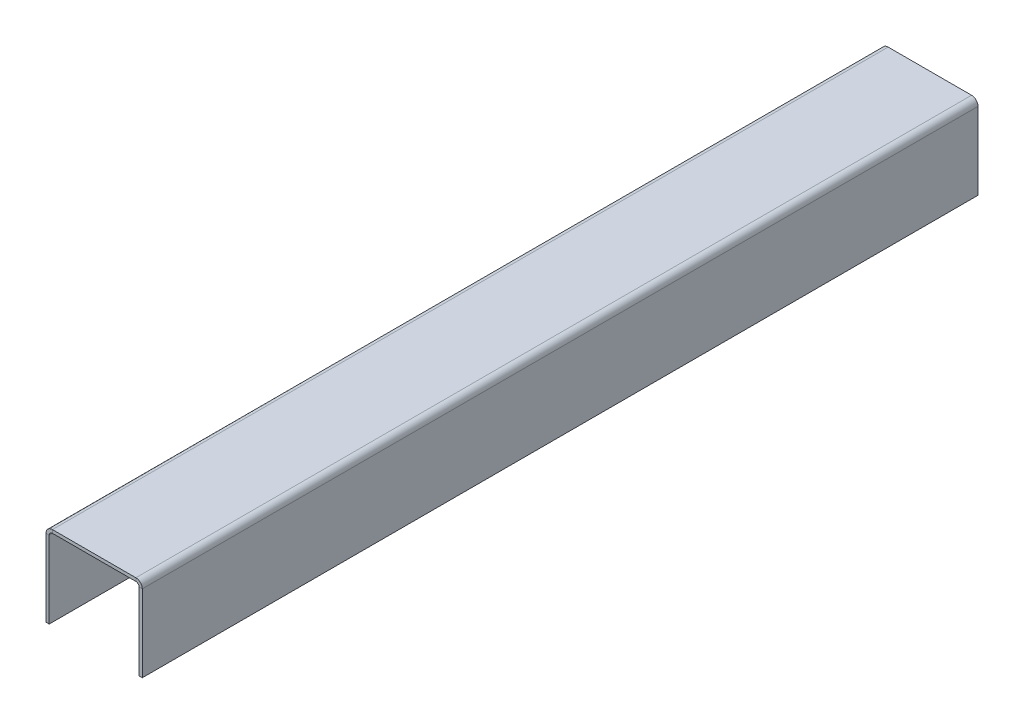
ISO-10303-21;
HEADER;
FILE_DESCRIPTION(('STEP AP214'),'2;1');
FILE_NAME('part.step','',(''),(''),'','','');
FILE_SCHEMA(('AUTOMOTIVE_DESIGN { 1 0 10303 214 1 1 1 1 }'));
ENDSEC;
DATA;
#1=APPLICATION_CONTEXT('core data for automotive mechanical design processes');
#2=APPLICATION_PROTOCOL_DEFINITION('international standard','automotive_design',2000,#1);
#3=PRODUCT_CONTEXT('',#1,'mechanical');
#4=PRODUCT('Part','Part','',(#3));
#5=PRODUCT_RELATED_PRODUCT_CATEGORY('part','',(#4));
#6=PRODUCT_DEFINITION_FORMATION('','',#4);
#7=PRODUCT_DEFINITION_CONTEXT('part definition',#1,'design');
#8=PRODUCT_DEFINITION('design','',#6,#7);
#9=PRODUCT_DEFINITION_SHAPE('','',#8);
#10=(LENGTH_UNIT() NAMED_UNIT(*) SI_UNIT(.MILLI.,.METRE.));
#11=(NAMED_UNIT(*) PLANE_ANGLE_UNIT() SI_UNIT($,.RADIAN.));
#12=(NAMED_UNIT(*) SI_UNIT($,.STERADIAN.) SOLID_ANGLE_UNIT());
#13=UNCERTAINTY_MEASURE_WITH_UNIT(LENGTH_MEASURE(1.E-05),#10,'distance_accuracy_value','');
#14=(GEOMETRIC_REPRESENTATION_CONTEXT(3) GLOBAL_UNCERTAINTY_ASSIGNED_CONTEXT((#13)) GLOBAL_UNIT_ASSIGNED_CONTEXT((#10,
#11,#12)) REPRESENTATION_CONTEXT('',''));
#15=CARTESIAN_POINT('',(0.,0.,0.));
#16=DIRECTION('',(0.,0.,1.));
#17=DIRECTION('',(1.,0.,0.));
#18=AXIS2_PLACEMENT_3D('',#15,#16,#17);
#19=CARTESIAN_POINT('',(6.35,82.55,826.77));
#20=DIRECTION('',(0.,0.,1.));
#21=DIRECTION('',(1.,0.,0.));
#22=AXIS2_PLACEMENT_3D('',#19,#20,#21);
#23=PLANE('',#22);
#24=DIRECTION('',(0.,-1.,0.));
#25=VECTOR('',#24,1.);
#26=CARTESIAN_POINT('',(6.35,82.55,826.77));
#27=LINE('',#26,#25);
#28=CARTESIAN_POINT('',(6.35,82.55,826.77));
#29=VERTEX_POINT('',#28);
#30=CARTESIAN_POINT('',(6.35,79.375,826.77));
#31=VERTEX_POINT('',#30);
#32=EDGE_CURVE('E11',#29,#31,#27,.T.);
#33=ORIENTED_EDGE('',*,*,#32,.F.);
#34=CARTESIAN_POINT('',(6.35,76.2,826.77));
#35=DIRECTION('',(0.,0.,1.));
#36=DIRECTION('',(1.,0.,0.));
#37=AXIS2_PLACEMENT_3D('',#34,#35,#36);
#38=CIRCLE('',#37,6.35);
#39=CARTESIAN_POINT('',(0.,76.2,826.77));
#40=VERTEX_POINT('',#39);
#41=EDGE_CURVE('E247',#40,#29,#38,.F.);
#42=ORIENTED_EDGE('',*,*,#41,.F.);
#43=DIRECTION('',(-1.,0.,0.));
#44=VECTOR('',#43,1.);
#45=CARTESIAN_POINT('',(3.175,76.2,826.77));
#46=LINE('',#45,#44);
#47=CARTESIAN_POINT('',(3.175,76.2,826.77));
#48=VERTEX_POINT('',#47);
#49=EDGE_CURVE('E45',#48,#40,#46,.T.);
#50=ORIENTED_EDGE('',*,*,#49,.F.);
#51=CARTESIAN_POINT('',(6.35,76.2,826.77));
#52=DIRECTION('',(0.,0.,1.));
#53=DIRECTION('',(1.,0.,0.));
#54=AXIS2_PLACEMENT_3D('',#51,#52,#53);
#55=CIRCLE('',#54,3.175);
#56=EDGE_CURVE('E146',#48,#31,#55,.F.);
#57=ORIENTED_EDGE('',*,*,#56,.T.);
#58=EDGE_LOOP('',(#33,#42,#50,#57));
#59=FACE_BOUND('',#58,.T.);
#60=ADVANCED_FACE('F37',(#59),#23,.T.);
#61=CARTESIAN_POINT('',(3.175,76.2,826.77));
#62=DIRECTION('',(0.,0.,1.));
#63=DIRECTION('',(1.,0.,0.));
#64=AXIS2_PLACEMENT_3D('',#61,#62,#63);
#65=PLANE('',#64);
#66=DIRECTION('',(1.,0.,0.));
#67=VECTOR('',#66,1.);
#68=CARTESIAN_POINT('',(0.,82.55,826.77));
#69=LINE('',#68,#67);
#70=CARTESIAN_POINT('',(88.9,82.55,826.77));
#71=VERTEX_POINT('',#70);
#72=EDGE_CURVE('E140',#29,#71,#69,.T.);
#73=ORIENTED_EDGE('',*,*,#72,.F.);
#74=ORIENTED_EDGE('',*,*,#32,.T.);
#75=DIRECTION('',(1.,0.,0.));
#76=VECTOR('',#75,1.);
#77=CARTESIAN_POINT('',(0.,79.375,826.77));
#78=LINE('',#77,#76);
#79=CARTESIAN_POINT('',(88.9,79.375,826.77));
#80=VERTEX_POINT('',#79);
#81=EDGE_CURVE('E137',#31,#80,#78,.T.);
#82=ORIENTED_EDGE('',*,*,#81,.T.);
#83=DIRECTION('',(0.,1.,0.));
#84=VECTOR('',#83,1.);
#85=CARTESIAN_POINT('',(88.9,79.375,826.77));
#86=LINE('',#85,#84);
#87=EDGE_CURVE('E228',#80,#71,#86,.T.);
#88=ORIENTED_EDGE('',*,*,#87,.T.);
#89=EDGE_LOOP('',(#73,#74,#82,#88));
#90=FACE_BOUND('',#89,.T.);
#91=ADVANCED_FACE('F135',(#90),#65,.T.);
#92=CARTESIAN_POINT('',(0.,76.2,0.));
#93=DIRECTION('',(0.,0.,-1.));
#94=DIRECTION('',(-1.,0.,0.));
#95=AXIS2_PLACEMENT_3D('',#92,#93,#94);
#96=PLANE('',#95);
#97=DIRECTION('',(1.,0.,0.));
#98=VECTOR('',#97,1.);
#99=CARTESIAN_POINT('',(0.,76.2,0.));
#100=LINE('',#99,#98);
#101=CARTESIAN_POINT('',(0.,76.2,0.));
#102=VERTEX_POINT('',#101);
#103=CARTESIAN_POINT('',(3.175,76.2,0.));
#104=VERTEX_POINT('',#103);
#105=EDGE_CURVE('E233',#102,#104,#100,.T.);
#106=ORIENTED_EDGE('',*,*,#105,.F.);
#107=CARTESIAN_POINT('',(6.35,76.2,0.));
#108=DIRECTION('',(0.,0.,1.));
#109=DIRECTION('',(1.,0.,0.));
#110=AXIS2_PLACEMENT_3D('',#107,#108,#109);
#111=CIRCLE('',#110,6.35);
#112=CARTESIAN_POINT('',(6.35,82.55,0.));
#113=VERTEX_POINT('',#112);
#114=EDGE_CURVE('E185',#102,#113,#111,.F.);
#115=ORIENTED_EDGE('',*,*,#114,.T.);
#116=DIRECTION('',(0.,1.,0.));
#117=VECTOR('',#116,1.);
#118=CARTESIAN_POINT('',(6.35,79.375,0.));
#119=LINE('',#118,#117);
#120=CARTESIAN_POINT('',(6.35,79.375,0.));
#121=VERTEX_POINT('',#120);
#122=EDGE_CURVE('E231',#121,#113,#119,.T.);
#123=ORIENTED_EDGE('',*,*,#122,.F.);
#124=CARTESIAN_POINT('',(6.35,76.2,0.));
#125=DIRECTION('',(0.,0.,1.));
#126=DIRECTION('',(1.,0.,0.));
#127=AXIS2_PLACEMENT_3D('',#124,#125,#126);
#128=CIRCLE('',#127,3.175);
#129=EDGE_CURVE('E158',#104,#121,#128,.F.);
#130=ORIENTED_EDGE('',*,*,#129,.F.);
#131=EDGE_LOOP('',(#106,#115,#123,#130));
#132=FACE_BOUND('',#131,.T.);
#133=ADVANCED_FACE('F285',(#132),#96,.T.);
#134=CARTESIAN_POINT('',(6.35,79.375,0.));
#135=DIRECTION('',(0.,0.,-1.));
#136=DIRECTION('',(-1.,0.,0.));
#137=AXIS2_PLACEMENT_3D('',#134,#135,#136);
#138=PLANE('',#137);
#139=DIRECTION('',(0.,1.,0.));
#140=VECTOR('',#139,1.);
#141=CARTESIAN_POINT('',(0.,0.,0.));
#142=LINE('',#141,#140);
#143=CARTESIAN_POINT('',(0.,0.,0.));
#144=VERTEX_POINT('',#143);
#145=EDGE_CURVE('E188',#144,#102,#142,.T.);
#146=ORIENTED_EDGE('',*,*,#145,.T.);
#147=ORIENTED_EDGE('',*,*,#105,.T.);
#148=DIRECTION('',(0.,1.,0.));
#149=VECTOR('',#148,1.);
#150=CARTESIAN_POINT('',(3.175,0.,0.));
#151=LINE('',#150,#149);
#152=CARTESIAN_POINT('',(3.175,0.,0.));
#153=VERTEX_POINT('',#152);
#154=EDGE_CURVE('E194',#153,#104,#151,.T.);
#155=ORIENTED_EDGE('',*,*,#154,.F.);
#156=DIRECTION('',(-1.,0.,0.));
#157=VECTOR('',#156,1.);
#158=CARTESIAN_POINT('',(3.175,0.,0.));
#159=LINE('',#158,#157);
#160=EDGE_CURVE('E191',#153,#144,#159,.T.);
#161=ORIENTED_EDGE('',*,*,#160,.T.);
#162=EDGE_LOOP('',(#146,#147,#155,#161));
#163=FACE_BOUND('',#162,.T.);
#164=ADVANCED_FACE('F288',(#163),#138,.T.);
#165=CARTESIAN_POINT('',(95.25,76.2,826.77));
#166=DIRECTION('',(0.,0.,1.));
#167=DIRECTION('',(1.,0.,0.));
#168=AXIS2_PLACEMENT_3D('',#165,#166,#167);
#169=PLANE('',#168);
#170=DIRECTION('',(-1.,0.,0.));
#171=VECTOR('',#170,1.);
#172=CARTESIAN_POINT('',(95.25,76.2,826.77));
#173=LINE('',#172,#171);
#174=CARTESIAN_POINT('',(95.25,76.2,826.77));
#175=VERTEX_POINT('',#174);
#176=CARTESIAN_POINT('',(92.075,76.2,826.77));
#177=VERTEX_POINT('',#176);
#178=EDGE_CURVE('E53',#175,#177,#173,.T.);
#179=ORIENTED_EDGE('',*,*,#178,.F.);
#180=CARTESIAN_POINT('',(88.9,76.2,826.77));
#181=DIRECTION('',(0.,0.,1.));
#182=DIRECTION('',(1.,0.,0.));
#183=AXIS2_PLACEMENT_3D('',#180,#181,#182);
#184=CIRCLE('',#183,6.35);
#185=EDGE_CURVE('E257',#71,#175,#184,.F.);
#186=ORIENTED_EDGE('',*,*,#185,.F.);
#187=ORIENTED_EDGE('',*,*,#87,.F.);
#188=CARTESIAN_POINT('',(88.9,76.2,826.77));
#189=DIRECTION('',(0.,0.,1.));
#190=DIRECTION('',(1.,0.,0.));
#191=AXIS2_PLACEMENT_3D('',#188,#189,#190);
#192=CIRCLE('',#191,3.175);
#193=EDGE_CURVE('E166',#80,#177,#192,.F.);
#194=ORIENTED_EDGE('',*,*,#193,.T.);
#195=EDGE_LOOP('',(#179,#186,#187,#194));
#196=FACE_BOUND('',#195,.T.);
#197=ADVANCED_FACE('F280',(#196),#169,.T.);
#198=CARTESIAN_POINT('',(88.9,79.375,826.77));
#199=DIRECTION('',(0.,0.,1.));
#200=DIRECTION('',(1.,0.,0.));
#201=AXIS2_PLACEMENT_3D('',#198,#199,#200);
#202=PLANE('',#201);
#203=DIRECTION('',(0.,-1.,0.));
#204=VECTOR('',#203,1.);
#205=CARTESIAN_POINT('',(95.25,82.55,826.77));
#206=LINE('',#205,#204);
#207=CARTESIAN_POINT('',(95.25,0.,826.77));
#208=VERTEX_POINT('',#207);
#209=EDGE_CURVE('E260',#175,#208,#206,.T.);
#210=ORIENTED_EDGE('',*,*,#209,.F.);
#211=ORIENTED_EDGE('',*,*,#178,.T.);
#212=DIRECTION('',(0.,-1.,0.));
#213=VECTOR('',#212,1.);
#214=CARTESIAN_POINT('',(92.075,82.55,826.77));
#215=LINE('',#214,#213);
#216=CARTESIAN_POINT('',(92.075,0.,826.77));
#217=VERTEX_POINT('',#216);
#218=EDGE_CURVE('E107',#177,#217,#215,.T.);
#219=ORIENTED_EDGE('',*,*,#218,.T.);
#220=DIRECTION('',(-1.,0.,0.));
#221=VECTOR('',#220,1.);
#222=CARTESIAN_POINT('',(95.25,0.,826.77));
#223=LINE('',#222,#221);
#224=EDGE_CURVE('E263',#208,#217,#223,.T.);
#225=ORIENTED_EDGE('',*,*,#224,.F.);
#226=EDGE_LOOP('',(#210,#211,#219,#225));
#227=FACE_BOUND('',#226,.T.);
#228=ADVANCED_FACE('F269',(#227),#202,.T.);
#229=CARTESIAN_POINT('',(88.9,82.55,0.));
#230=DIRECTION('',(0.,0.,-1.));
#231=DIRECTION('',(-1.,0.,0.));
#232=AXIS2_PLACEMENT_3D('',#229,#230,#231);
#233=PLANE('',#232);
#234=DIRECTION('',(0.,-1.,0.));
#235=VECTOR('',#234,1.);
#236=CARTESIAN_POINT('',(88.9,82.55,0.));
#237=LINE('',#236,#235);
#238=CARTESIAN_POINT('',(88.9,82.55,0.));
#239=VERTEX_POINT('',#238);
#240=CARTESIAN_POINT('',(88.9,79.375,0.));
#241=VERTEX_POINT('',#240);
#242=EDGE_CURVE('E94',#239,#241,#237,.T.);
#243=ORIENTED_EDGE('',*,*,#242,.F.);
#244=CARTESIAN_POINT('',(88.9,76.2,0.));
#245=DIRECTION('',(0.,0.,1.));
#246=DIRECTION('',(1.,0.,0.));
#247=AXIS2_PLACEMENT_3D('',#244,#245,#246);
#248=CIRCLE('',#247,6.35);
#249=CARTESIAN_POINT('',(95.25,76.2,0.));
#250=VERTEX_POINT('',#249);
#251=EDGE_CURVE('E181',#239,#250,#248,.F.);
#252=ORIENTED_EDGE('',*,*,#251,.T.);
#253=DIRECTION('',(1.,0.,0.));
#254=VECTOR('',#253,1.);
#255=CARTESIAN_POINT('',(92.075,76.2,0.));
#256=LINE('',#255,#254);
#257=CARTESIAN_POINT('',(92.075,76.2,0.));
#258=VERTEX_POINT('',#257);
#259=EDGE_CURVE('E101',#258,#250,#256,.T.);
#260=ORIENTED_EDGE('',*,*,#259,.F.);
#261=CARTESIAN_POINT('',(88.9,76.2,0.));
#262=DIRECTION('',(0.,0.,1.));
#263=DIRECTION('',(1.,0.,0.));
#264=AXIS2_PLACEMENT_3D('',#261,#262,#263);
#265=CIRCLE('',#264,3.175);
#266=EDGE_CURVE('E200',#241,#258,#265,.F.);
#267=ORIENTED_EDGE('',*,*,#266,.F.);
#268=EDGE_LOOP('',(#243,#252,#260,#267));
#269=FACE_BOUND('',#268,.T.);
#270=ADVANCED_FACE('F317',(#269),#233,.T.);
#271=CARTESIAN_POINT('',(92.075,76.2,0.));
#272=DIRECTION('',(0.,0.,-1.));
#273=DIRECTION('',(-1.,0.,0.));
#274=AXIS2_PLACEMENT_3D('',#271,#272,#273);
#275=PLANE('',#274);
#276=DIRECTION('',(1.,0.,0.));
#277=VECTOR('',#276,1.);
#278=CARTESIAN_POINT('',(0.,82.55,0.));
#279=LINE('',#278,#277);
#280=EDGE_CURVE('E183',#113,#239,#279,.T.);
#281=ORIENTED_EDGE('',*,*,#280,.T.);
#282=ORIENTED_EDGE('',*,*,#242,.T.);
#283=DIRECTION('',(1.,0.,0.));
#284=VECTOR('',#283,1.);
#285=CARTESIAN_POINT('',(0.,79.375,0.));
#286=LINE('',#285,#284);
#287=EDGE_CURVE('E198',#121,#241,#286,.T.);
#288=ORIENTED_EDGE('',*,*,#287,.F.);
#289=ORIENTED_EDGE('',*,*,#122,.T.);
#290=EDGE_LOOP('',(#281,#282,#288,#289));
#291=FACE_BOUND('',#290,.T.);
#292=ADVANCED_FACE('F320',(#291),#275,.T.);
#293=CARTESIAN_POINT('',(92.075,82.55,826.77));
#294=DIRECTION('',(1.,0.,0.));
#295=DIRECTION('',(0.,1.,0.));
#296=AXIS2_PLACEMENT_3D('',#293,#294,#295);
#297=PLANE('',#296);
#298=DIRECTION('',(0.,-1.,0.));
#299=VECTOR('',#298,1.);
#300=CARTESIAN_POINT('',(92.075,82.55,0.));
#301=LINE('',#300,#299);
#302=CARTESIAN_POINT('',(92.075,0.,0.));
#303=VERTEX_POINT('',#302);
#304=EDGE_CURVE('E172',#258,#303,#301,.T.);
#305=ORIENTED_EDGE('',*,*,#304,.T.);
#306=DIRECTION('',(0.,0.,-1.));
#307=VECTOR('',#306,1.);
#308=CARTESIAN_POINT('',(92.075,0.,826.77));
#309=LINE('',#308,#307);
#310=EDGE_CURVE('E224',#217,#303,#309,.T.);
#311=ORIENTED_EDGE('',*,*,#310,.F.);
#312=ORIENTED_EDGE('',*,*,#218,.F.);
#313=DIRECTION('',(0.,0.,-1.));
#314=VECTOR('',#313,1.);
#315=CARTESIAN_POINT('',(92.075,76.2,826.77));
#316=LINE('',#315,#314);
#317=EDGE_CURVE('E168',#177,#258,#316,.T.);
#318=ORIENTED_EDGE('',*,*,#317,.T.);
#319=EDGE_LOOP('',(#305,#311,#312,#318));
#320=FACE_BOUND('',#319,.T.);
#321=ADVANCED_FACE('F323',(#320),#297,.F.);
#322=CARTESIAN_POINT('',(95.25,0.,826.77));
#323=DIRECTION('',(0.,-1.,0.));
#324=DIRECTION('',(0.,0.,-1.));
#325=AXIS2_PLACEMENT_3D('',#322,#323,#324);
#326=PLANE('',#325);
#327=DIRECTION('',(-1.,0.,0.));
#328=VECTOR('',#327,1.);
#329=CARTESIAN_POINT('',(95.25,0.,0.));
#330=LINE('',#329,#328);
#331=CARTESIAN_POINT('',(95.25,0.,0.));
#332=VERTEX_POINT('',#331);
#333=EDGE_CURVE('E175',#332,#303,#330,.T.);
#334=ORIENTED_EDGE('',*,*,#333,.F.);
#335=DIRECTION('',(0.,0.,-1.));
#336=VECTOR('',#335,1.);
#337=CARTESIAN_POINT('',(95.25,0.,826.77));
#338=LINE('',#337,#336);
#339=EDGE_CURVE('E222',#208,#332,#338,.T.);
#340=ORIENTED_EDGE('',*,*,#339,.F.);
#341=ORIENTED_EDGE('',*,*,#224,.T.);
#342=ORIENTED_EDGE('',*,*,#310,.T.);
#343=EDGE_LOOP('',(#334,#340,#341,#342));
#344=FACE_BOUND('',#343,.T.);
#345=ADVANCED_FACE('F268',(#344),#326,.T.);
#346=CARTESIAN_POINT('',(95.25,82.55,826.77));
#347=DIRECTION('',(1.,0.,0.));
#348=DIRECTION('',(0.,1.,0.));
#349=AXIS2_PLACEMENT_3D('',#346,#347,#348);
#350=PLANE('',#349);
#351=DIRECTION('',(0.,-1.,0.));
#352=VECTOR('',#351,1.);
#353=CARTESIAN_POINT('',(95.25,82.55,0.));
#354=LINE('',#353,#352);
#355=EDGE_CURVE('E178',#250,#332,#354,.T.);
#356=ORIENTED_EDGE('',*,*,#355,.F.);
#357=DIRECTION('',(0.,0.,-1.));
#358=VECTOR('',#357,1.);
#359=CARTESIAN_POINT('',(95.25,76.2,826.77));
#360=LINE('',#359,#358);
#361=EDGE_CURVE('E219',#175,#250,#360,.T.);
#362=ORIENTED_EDGE('',*,*,#361,.F.);
#363=ORIENTED_EDGE('',*,*,#209,.T.);
#364=ORIENTED_EDGE('',*,*,#339,.T.);
#365=EDGE_LOOP('',(#356,#362,#363,#364));
#366=FACE_BOUND('',#365,.T.);
#367=ADVANCED_FACE('F273',(#366),#350,.T.);
#368=CARTESIAN_POINT('',(88.9,76.2,826.77));
#369=DIRECTION('',(0.,0.,-1.));
#370=DIRECTION('',(-1.,0.,0.));
#371=AXIS2_PLACEMENT_3D('',#368,#369,#370);
#372=CYLINDRICAL_SURFACE('',#371,6.35);
#373=ORIENTED_EDGE('',*,*,#251,.F.);
#374=DIRECTION('',(0.,0.,-1.));
#375=VECTOR('',#374,1.);
#376=CARTESIAN_POINT('',(88.9,82.55,826.77));
#377=LINE('',#376,#375);
#378=EDGE_CURVE('E216',#71,#239,#377,.T.);
#379=ORIENTED_EDGE('',*,*,#378,.F.);
#380=ORIENTED_EDGE('',*,*,#185,.T.);
#381=ORIENTED_EDGE('',*,*,#361,.T.);
#382=EDGE_LOOP('',(#373,#379,#380,#381));
#383=FACE_BOUND('',#382,.T.);
#384=ADVANCED_FACE('F276',(#383),#372,.T.);
#385=CARTESIAN_POINT('',(0.,82.55,826.77));
#386=DIRECTION('',(0.,1.,0.));
#387=DIRECTION('',(0.,0.,1.));
#388=AXIS2_PLACEMENT_3D('',#385,#386,#387);
#389=PLANE('',#388);
#390=ORIENTED_EDGE('',*,*,#280,.F.);
#391=DIRECTION('',(0.,0.,-1.));
#392=VECTOR('',#391,1.);
#393=CARTESIAN_POINT('',(6.35,82.55,826.77));
#394=LINE('',#393,#392);
#395=EDGE_CURVE('E213',#29,#113,#394,.T.);
#396=ORIENTED_EDGE('',*,*,#395,.F.);
#397=ORIENTED_EDGE('',*,*,#72,.T.);
#398=ORIENTED_EDGE('',*,*,#378,.T.);
#399=EDGE_LOOP('',(#390,#396,#397,#398));
#400=FACE_BOUND('',#399,.T.);
#401=ADVANCED_FACE('F283',(#400),#389,.T.);
#402=CARTESIAN_POINT('',(6.35,76.2,826.77));
#403=DIRECTION('',(0.,0.,-1.));
#404=DIRECTION('',(-1.,0.,0.));
#405=AXIS2_PLACEMENT_3D('',#402,#403,#404);
#406=CYLINDRICAL_SURFACE('',#405,6.35);
#407=ORIENTED_EDGE('',*,*,#114,.F.);
#408=DIRECTION('',(0.,0.,-1.));
#409=VECTOR('',#408,1.);
#410=CARTESIAN_POINT('',(0.,76.2,826.77));
#411=LINE('',#410,#409);
#412=EDGE_CURVE('E210',#40,#102,#411,.T.);
#413=ORIENTED_EDGE('',*,*,#412,.F.);
#414=ORIENTED_EDGE('',*,*,#41,.T.);
#415=ORIENTED_EDGE('',*,*,#395,.T.);
#416=EDGE_LOOP('',(#407,#413,#414,#415));
#417=FACE_BOUND('',#416,.T.);
#418=ADVANCED_FACE('F246',(#417),#406,.T.);
#419=CARTESIAN_POINT('',(0.,0.,826.77));
#420=DIRECTION('',(-1.,0.,0.));
#421=DIRECTION('',(0.,0.,1.));
#422=AXIS2_PLACEMENT_3D('',#419,#420,#421);
#423=PLANE('',#422);
#424=ORIENTED_EDGE('',*,*,#145,.F.);
#425=DIRECTION('',(0.,0.,-1.));
#426=VECTOR('',#425,1.);
#427=CARTESIAN_POINT('',(0.,0.,826.77));
#428=LINE('',#427,#426);
#429=CARTESIAN_POINT('',(0.,0.,826.77));
#430=VERTEX_POINT('',#429);
#431=EDGE_CURVE('E208',#430,#144,#428,.T.);
#432=ORIENTED_EDGE('',*,*,#431,.F.);
#433=DIRECTION('',(0.,1.,0.));
#434=VECTOR('',#433,1.);
#435=CARTESIAN_POINT('',(0.,0.,826.77));
#436=LINE('',#435,#434);
#437=EDGE_CURVE('E240',#430,#40,#436,.T.);
#438=ORIENTED_EDGE('',*,*,#437,.T.);
#439=ORIENTED_EDGE('',*,*,#412,.T.);
#440=EDGE_LOOP('',(#424,#432,#438,#439));
#441=FACE_BOUND('',#440,.T.);
#442=ADVANCED_FACE('F251',(#441),#423,.T.);
#443=CARTESIAN_POINT('',(3.175,0.,826.77));
#444=DIRECTION('',(0.,-1.,0.));
#445=DIRECTION('',(0.,0.,-1.));
#446=AXIS2_PLACEMENT_3D('',#443,#444,#445);
#447=PLANE('',#446);
#448=ORIENTED_EDGE('',*,*,#160,.F.);
#449=DIRECTION('',(0.,0.,-1.));
#450=VECTOR('',#449,1.);
#451=CARTESIAN_POINT('',(3.175,0.,826.77));
#452=LINE('',#451,#450);
#453=CARTESIAN_POINT('',(3.175,0.,826.77));
#454=VERTEX_POINT('',#453);
#455=EDGE_CURVE('E206',#454,#153,#452,.T.);
#456=ORIENTED_EDGE('',*,*,#455,.F.);
#457=DIRECTION('',(-1.,0.,0.));
#458=VECTOR('',#457,1.);
#459=CARTESIAN_POINT('',(3.175,0.,826.77));
#460=LINE('',#459,#458);
#461=EDGE_CURVE('E252',#454,#430,#460,.T.);
#462=ORIENTED_EDGE('',*,*,#461,.T.);
#463=ORIENTED_EDGE('',*,*,#431,.T.);
#464=EDGE_LOOP('',(#448,#456,#462,#463));
#465=FACE_BOUND('',#464,.T.);
#466=ADVANCED_FACE('F293',(#465),#447,.T.);
#467=CARTESIAN_POINT('',(3.175,0.,826.77));
#468=DIRECTION('',(-1.,0.,0.));
#469=DIRECTION('',(0.,0.,1.));
#470=AXIS2_PLACEMENT_3D('',#467,#468,#469);
#471=PLANE('',#470);
#472=ORIENTED_EDGE('',*,*,#154,.T.);
#473=DIRECTION('',(0.,0.,-1.));
#474=VECTOR('',#473,1.);
#475=CARTESIAN_POINT('',(3.175,76.2,826.77));
#476=LINE('',#475,#474);
#477=EDGE_CURVE('E160',#48,#104,#476,.T.);
#478=ORIENTED_EDGE('',*,*,#477,.F.);
#479=DIRECTION('',(0.,1.,0.));
#480=VECTOR('',#479,1.);
#481=CARTESIAN_POINT('',(3.175,0.,826.77));
#482=LINE('',#481,#480);
#483=EDGE_CURVE('E151',#454,#48,#482,.T.);
#484=ORIENTED_EDGE('',*,*,#483,.F.);
#485=ORIENTED_EDGE('',*,*,#455,.T.);
#486=EDGE_LOOP('',(#472,#478,#484,#485));
#487=FACE_BOUND('',#486,.T.);
#488=ADVANCED_FACE('F291',(#487),#471,.F.);
#489=CARTESIAN_POINT('',(6.35,76.2,826.77));
#490=DIRECTION('',(0.,0.,-1.));
#491=DIRECTION('',(-1.,0.,0.));
#492=AXIS2_PLACEMENT_3D('',#489,#490,#491);
#493=CYLINDRICAL_SURFACE('',#492,3.175);
#494=ORIENTED_EDGE('',*,*,#129,.T.);
#495=DIRECTION('',(0.,0.,-1.));
#496=VECTOR('',#495,1.);
#497=CARTESIAN_POINT('',(6.35,79.375,826.77));
#498=LINE('',#497,#496);
#499=EDGE_CURVE('E155',#31,#121,#498,.T.);
#500=ORIENTED_EDGE('',*,*,#499,.F.);
#501=ORIENTED_EDGE('',*,*,#56,.F.);
#502=ORIENTED_EDGE('',*,*,#477,.T.);
#503=EDGE_LOOP('',(#494,#500,#501,#502));
#504=FACE_BOUND('',#503,.T.);
#505=ADVANCED_FACE('F156',(#504),#493,.F.);
#506=CARTESIAN_POINT('',(0.,79.375,826.77));
#507=DIRECTION('',(0.,1.,0.));
#508=DIRECTION('',(0.,0.,1.));
#509=AXIS2_PLACEMENT_3D('',#506,#507,#508);
#510=PLANE('',#509);
#511=ORIENTED_EDGE('',*,*,#287,.T.);
#512=DIRECTION('',(0.,0.,-1.));
#513=VECTOR('',#512,1.);
#514=CARTESIAN_POINT('',(88.9,79.375,826.77));
#515=LINE('',#514,#513);
#516=EDGE_CURVE('E161',#80,#241,#515,.T.);
#517=ORIENTED_EDGE('',*,*,#516,.F.);
#518=ORIENTED_EDGE('',*,*,#81,.F.);
#519=ORIENTED_EDGE('',*,*,#499,.T.);
#520=EDGE_LOOP('',(#511,#517,#518,#519));
#521=FACE_BOUND('',#520,.T.);
#522=ADVANCED_FACE('F163',(#521),#510,.F.);
#523=CARTESIAN_POINT('',(88.9,76.2,826.77));
#524=DIRECTION('',(0.,0.,-1.));
#525=DIRECTION('',(-1.,0.,0.));
#526=AXIS2_PLACEMENT_3D('',#523,#524,#525);
#527=CYLINDRICAL_SURFACE('',#526,3.175);
#528=ORIENTED_EDGE('',*,*,#266,.T.);
#529=ORIENTED_EDGE('',*,*,#317,.F.);
#530=ORIENTED_EDGE('',*,*,#193,.F.);
#531=ORIENTED_EDGE('',*,*,#516,.T.);
#532=EDGE_LOOP('',(#528,#529,#530,#531));
#533=FACE_BOUND('',#532,.T.);
#534=ADVANCED_FACE('F375',(#533),#527,.F.);
#535=CARTESIAN_POINT('',(88.9,76.2,826.77));
#536=DIRECTION('',(0.,0.,1.));
#537=DIRECTION('',(1.,0.,0.));
#538=AXIS2_PLACEMENT_3D('',#535,#536,#537);
#539=PLANE('',#538);
#540=ORIENTED_EDGE('',*,*,#483,.T.);
#541=ORIENTED_EDGE('',*,*,#49,.T.);
#542=ORIENTED_EDGE('',*,*,#437,.F.);
#543=ORIENTED_EDGE('',*,*,#461,.F.);
#544=EDGE_LOOP('',(#540,#541,#542,#543));
#545=FACE_BOUND('',#544,.T.);
#546=ADVANCED_FACE('F237',(#545),#539,.T.);
#547=CARTESIAN_POINT('',(88.9,76.2,0.));
#548=DIRECTION('',(0.,0.,1.));
#549=DIRECTION('',(1.,0.,0.));
#550=AXIS2_PLACEMENT_3D('',#547,#548,#549);
#551=PLANE('',#550);
#552=ORIENTED_EDGE('',*,*,#304,.F.);
#553=ORIENTED_EDGE('',*,*,#259,.T.);
#554=ORIENTED_EDGE('',*,*,#355,.T.);
#555=ORIENTED_EDGE('',*,*,#333,.T.);
#556=EDGE_LOOP('',(#552,#553,#554,#555));
#557=FACE_BOUND('',#556,.T.);
#558=ADVANCED_FACE('F395',(#557),#551,.F.);
#559=CLOSED_SHELL('',(#60,#91,#133,#164,#197,#228,#270,#292,#321,#345,#367,#384,#401,#418,#442,
#466,#488,#505,#522,#534,#546,#558));
#560=MANIFOLD_SOLID_BREP('B2',#559);
#561=ADVANCED_BREP_SHAPE_REPRESENTATION('',(#18,#560),#14);
#562=SHAPE_DEFINITION_REPRESENTATION(#9,#561);
ENDSEC;
END-ISO-10303-21;
